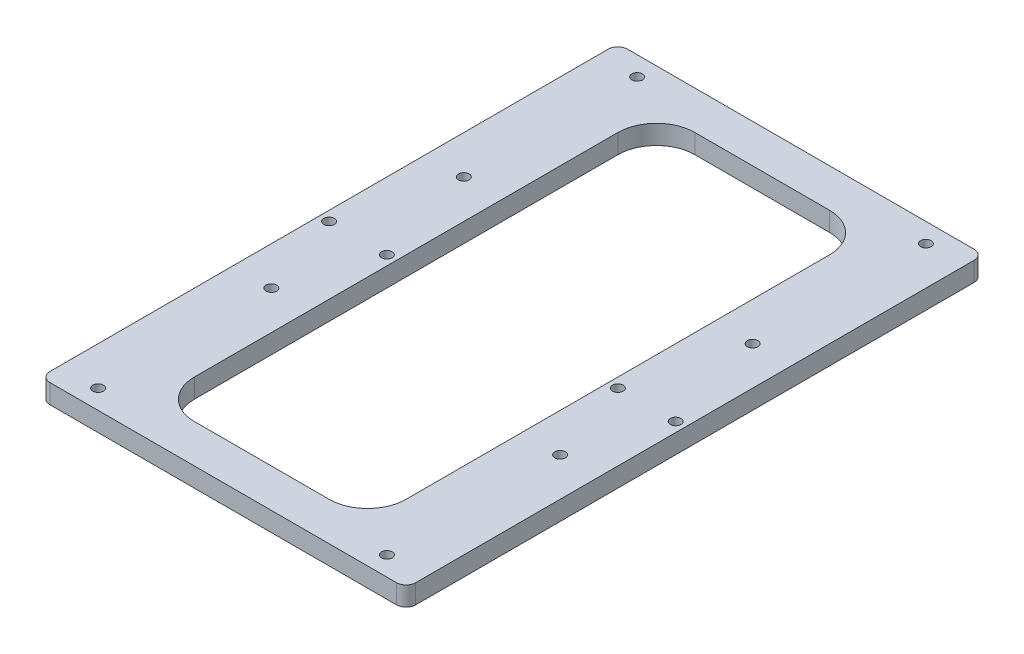
ISO-10303-21;
HEADER;
FILE_DESCRIPTION(('STEP AP214'),'2;1');
FILE_NAME('part.step','',(''),(''),'','','');
FILE_SCHEMA(('AUTOMOTIVE_DESIGN { 1 0 10303 214 1 1 1 1 }'));
ENDSEC;
DATA;
#1=APPLICATION_CONTEXT('core data for automotive mechanical design processes');
#2=APPLICATION_PROTOCOL_DEFINITION('international standard','automotive_design',2000,#1);
#3=PRODUCT_CONTEXT('',#1,'mechanical');
#4=PRODUCT('Part','Part','',(#3));
#5=PRODUCT_RELATED_PRODUCT_CATEGORY('part','',(#4));
#6=PRODUCT_DEFINITION_FORMATION('','',#4);
#7=PRODUCT_DEFINITION_CONTEXT('part definition',#1,'design');
#8=PRODUCT_DEFINITION('design','',#6,#7);
#9=PRODUCT_DEFINITION_SHAPE('','',#8);
#10=(LENGTH_UNIT() NAMED_UNIT(*) SI_UNIT(.MILLI.,.METRE.));
#11=(NAMED_UNIT(*) PLANE_ANGLE_UNIT() SI_UNIT($,.RADIAN.));
#12=(NAMED_UNIT(*) SI_UNIT($,.STERADIAN.) SOLID_ANGLE_UNIT());
#13=UNCERTAINTY_MEASURE_WITH_UNIT(LENGTH_MEASURE(1.E-05),#10,'distance_accuracy_value','');
#14=(GEOMETRIC_REPRESENTATION_CONTEXT(3) GLOBAL_UNCERTAINTY_ASSIGNED_CONTEXT((#13)) GLOBAL_UNIT_ASSIGNED_CONTEXT((#10,
#11,#12)) REPRESENTATION_CONTEXT('',''));
#15=CARTESIAN_POINT('',(0.,0.,0.));
#16=DIRECTION('',(0.,0.,1.));
#17=DIRECTION('',(1.,0.,0.));
#18=AXIS2_PLACEMENT_3D('',#15,#16,#17);
#19=CARTESIAN_POINT('',(-20.,10.,-150.));
#20=DIRECTION('',(1.,0.,0.));
#21=DIRECTION('',(0.,0.,-1.));
#22=AXIS2_PLACEMENT_3D('',#19,#20,#21);
#23=PLANE('',#22);
#24=DIRECTION('',(0.,0.,1.));
#25=VECTOR('',#24,1.);
#26=CARTESIAN_POINT('',(-20.,10.,-150.));
#27=LINE('',#26,#25);
#28=CARTESIAN_POINT('',(-20.,10.,-110.));
#29=VERTEX_POINT('',#28);
#30=CARTESIAN_POINT('',(-20.,10.,110.));
#31=VERTEX_POINT('',#30);
#32=EDGE_CURVE('E270',#29,#31,#27,.T.);
#33=ORIENTED_EDGE('',*,*,#32,.F.);
#34=DIRECTION('',(0.,1.,0.));
#35=VECTOR('',#34,1.);
#36=CARTESIAN_POINT('',(-20.,0.,-110.));
#37=LINE('',#36,#35);
#38=CARTESIAN_POINT('',(-20.,0.,-110.));
#39=VERTEX_POINT('',#38);
#40=EDGE_CURVE('E299',#29,#39,#37,.F.);
#41=ORIENTED_EDGE('',*,*,#40,.T.);
#42=DIRECTION('',(0.,0.,1.));
#43=VECTOR('',#42,1.);
#44=CARTESIAN_POINT('',(-20.,0.,-150.));
#45=LINE('',#44,#43);
#46=CARTESIAN_POINT('',(-20.,0.,110.));
#47=VERTEX_POINT('',#46);
#48=EDGE_CURVE('E282',#39,#47,#45,.T.);
#49=ORIENTED_EDGE('',*,*,#48,.T.);
#50=DIRECTION('',(0.,1.,0.));
#51=VECTOR('',#50,1.);
#52=CARTESIAN_POINT('',(-20.,10.,110.));
#53=LINE('',#52,#51);
#54=EDGE_CURVE('E296',#47,#31,#53,.T.);
#55=ORIENTED_EDGE('',*,*,#54,.T.);
#56=EDGE_LOOP('',(#33,#41,#49,#55));
#57=FACE_BOUND('',#56,.T.);
#58=ADVANCED_FACE('F16',(#57),#23,.F.);
#59=CARTESIAN_POINT('',(-130.,10.,-150.));
#60=DIRECTION('',(-1.,0.,0.));
#61=DIRECTION('',(0.,0.,1.));
#62=AXIS2_PLACEMENT_3D('',#59,#60,#61);
#63=PLANE('',#62);
#64=DIRECTION('',(0.,0.,-1.));
#65=VECTOR('',#64,1.);
#66=CARTESIAN_POINT('',(-130.,0.,-150.));
#67=LINE('',#66,#65);
#68=CARTESIAN_POINT('',(-130.,0.,110.));
#69=VERTEX_POINT('',#68);
#70=CARTESIAN_POINT('',(-130.,0.,-110.));
#71=VERTEX_POINT('',#70);
#72=EDGE_CURVE('E199',#69,#71,#67,.T.);
#73=ORIENTED_EDGE('',*,*,#72,.T.);
#74=DIRECTION('',(0.,1.,0.));
#75=VECTOR('',#74,1.);
#76=CARTESIAN_POINT('',(-130.,10.,-110.));
#77=LINE('',#76,#75);
#78=CARTESIAN_POINT('',(-130.,10.,-110.));
#79=VERTEX_POINT('',#78);
#80=EDGE_CURVE('E288',#71,#79,#77,.T.);
#81=ORIENTED_EDGE('',*,*,#80,.T.);
#82=DIRECTION('',(0.,0.,-1.));
#83=VECTOR('',#82,1.);
#84=CARTESIAN_POINT('',(-130.,10.,-150.));
#85=LINE('',#84,#83);
#86=CARTESIAN_POINT('',(-130.,10.,110.));
#87=VERTEX_POINT('',#86);
#88=EDGE_CURVE('E200',#87,#79,#85,.T.);
#89=ORIENTED_EDGE('',*,*,#88,.F.);
#90=DIRECTION('',(0.,1.,0.));
#91=VECTOR('',#90,1.);
#92=CARTESIAN_POINT('',(-130.,10.,110.));
#93=LINE('',#92,#91);
#94=EDGE_CURVE('E276',#87,#69,#93,.F.);
#95=ORIENTED_EDGE('',*,*,#94,.T.);
#96=EDGE_LOOP('',(#73,#81,#89,#95));
#97=FACE_BOUND('',#96,.T.);
#98=ADVANCED_FACE('F393',(#97),#63,.F.);
#99=CARTESIAN_POINT('',(0.,0.,0.));
#100=DIRECTION('',(0.,1.,0.));
#101=DIRECTION('',(0.,0.,1.));
#102=AXIS2_PLACEMENT_3D('',#99,#100,#101);
#103=PLANE('',#102);
#104=ORIENTED_EDGE('',*,*,#48,.F.);
#105=CARTESIAN_POINT('',(-40.,0.,-110.));
#106=DIRECTION('',(0.,1.,0.));
#107=DIRECTION('',(0.,0.,1.));
#108=AXIS2_PLACEMENT_3D('',#105,#106,#107);
#109=CIRCLE('',#108,20.);
#110=CARTESIAN_POINT('',(-40.,0.,-130.));
#111=VERTEX_POINT('',#110);
#112=EDGE_CURVE('E312',#39,#111,#109,.T.);
#113=ORIENTED_EDGE('',*,*,#112,.T.);
#114=DIRECTION('',(1.,0.,0.));
#115=VECTOR('',#114,1.);
#116=CARTESIAN_POINT('',(-20.,0.,-130.));
#117=LINE('',#116,#115);
#118=CARTESIAN_POINT('',(-110.,0.,-130.));
#119=VERTEX_POINT('',#118);
#120=EDGE_CURVE('E157',#119,#111,#117,.T.);
#121=ORIENTED_EDGE('',*,*,#120,.F.);
#122=CARTESIAN_POINT('',(-110.,0.,-110.));
#123=DIRECTION('',(0.,1.,0.));
#124=DIRECTION('',(0.,0.,1.));
#125=AXIS2_PLACEMENT_3D('',#122,#123,#124);
#126=CIRCLE('',#125,20.);
#127=EDGE_CURVE('E308',#119,#71,#126,.T.);
#128=ORIENTED_EDGE('',*,*,#127,.T.);
#129=ORIENTED_EDGE('',*,*,#72,.F.);
#130=CARTESIAN_POINT('',(-110.,0.,110.));
#131=DIRECTION('',(0.,1.,0.));
#132=DIRECTION('',(0.,0.,1.));
#133=AXIS2_PLACEMENT_3D('',#130,#131,#132);
#134=CIRCLE('',#133,20.);
#135=CARTESIAN_POINT('',(-110.,0.,130.));
#136=VERTEX_POINT('',#135);
#137=EDGE_CURVE('E320',#69,#136,#134,.T.);
#138=ORIENTED_EDGE('',*,*,#137,.T.);
#139=DIRECTION('',(1.,0.,0.));
#140=VECTOR('',#139,1.);
#141=CARTESIAN_POINT('',(-20.,0.,130.));
#142=LINE('',#141,#140);
#143=CARTESIAN_POINT('',(-40.,0.,130.));
#144=VERTEX_POINT('',#143);
#145=EDGE_CURVE('E212',#136,#144,#142,.T.);
#146=ORIENTED_EDGE('',*,*,#145,.T.);
#147=CARTESIAN_POINT('',(-40.,0.,110.));
#148=DIRECTION('',(0.,1.,0.));
#149=DIRECTION('',(0.,0.,1.));
#150=AXIS2_PLACEMENT_3D('',#147,#148,#149);
#151=CIRCLE('',#150,20.);
#152=EDGE_CURVE('E316',#144,#47,#151,.T.);
#153=ORIENTED_EDGE('',*,*,#152,.T.);
#154=EDGE_LOOP('',(#104,#113,#121,#128,#129,#138,#146,#153));
#155=FACE_BOUND('',#154,.T.);
#156=CARTESIAN_POINT('',(-150.,0.,-50.));
#157=DIRECTION('',(0.,1.,0.));
#158=DIRECTION('',(0.,0.,1.));
#159=AXIS2_PLACEMENT_3D('',#156,#157,#158);
#160=CIRCLE('',#159,2.75);
#161=CARTESIAN_POINT('',(-150.,0.,-47.25));
#162=VERTEX_POINT('',#161);
#163=EDGE_CURVE('E166',#162,#162,#160,.T.);
#164=ORIENTED_EDGE('',*,*,#163,.T.);
#165=EDGE_LOOP('',(#164));
#166=FACE_BOUND('',#165,.T.);
#167=CARTESIAN_POINT('',(-150.,0.,50.));
#168=DIRECTION('',(0.,1.,0.));
#169=DIRECTION('',(0.,0.,1.));
#170=AXIS2_PLACEMENT_3D('',#167,#168,#169);
#171=CIRCLE('',#170,2.75);
#172=CARTESIAN_POINT('',(-150.,0.,52.75));
#173=VERTEX_POINT('',#172);
#174=EDGE_CURVE('E172',#173,#173,#171,.T.);
#175=ORIENTED_EDGE('',*,*,#174,.T.);
#176=EDGE_LOOP('',(#175));
#177=FACE_BOUND('',#176,.T.);
#178=CARTESIAN_POINT('',(-150.,0.,140.));
#179=DIRECTION('',(0.,1.,0.));
#180=DIRECTION('',(0.,0.,1.));
#181=AXIS2_PLACEMENT_3D('',#178,#179,#180);
#182=CIRCLE('',#181,2.75);
#183=CARTESIAN_POINT('',(-150.,0.,142.75));
#184=VERTEX_POINT('',#183);
#185=EDGE_CURVE('E178',#184,#184,#182,.T.);
#186=ORIENTED_EDGE('',*,*,#185,.T.);
#187=EDGE_LOOP('',(#186));
#188=FACE_BOUND('',#187,.T.);
#189=CARTESIAN_POINT('',(-150.,0.,-140.));
#190=DIRECTION('',(0.,1.,0.));
#191=DIRECTION('',(0.,0.,1.));
#192=AXIS2_PLACEMENT_3D('',#189,#190,#191);
#193=CIRCLE('',#192,2.75);
#194=CARTESIAN_POINT('',(-150.,0.,-137.25));
#195=VERTEX_POINT('',#194);
#196=EDGE_CURVE('E184',#195,#195,#193,.T.);
#197=ORIENTED_EDGE('',*,*,#196,.T.);
#198=EDGE_LOOP('',(#197));
#199=FACE_BOUND('',#198,.T.);
#200=CARTESIAN_POINT('',(-135.,0.,5.));
#201=DIRECTION('',(0.,1.,0.));
#202=DIRECTION('',(0.,0.,1.));
#203=AXIS2_PLACEMENT_3D('',#200,#201,#202);
#204=CIRCLE('',#203,2.75);
#205=CARTESIAN_POINT('',(-135.,0.,7.75));
#206=VERTEX_POINT('',#205);
#207=EDGE_CURVE('E187',#206,#206,#204,.T.);
#208=ORIENTED_EDGE('',*,*,#207,.T.);
#209=EDGE_LOOP('',(#208));
#210=FACE_BOUND('',#209,.T.);
#211=CARTESIAN_POINT('',(-165.,0.,5.));
#212=DIRECTION('',(0.,1.,0.));
#213=DIRECTION('',(0.,0.,1.));
#214=AXIS2_PLACEMENT_3D('',#211,#212,#213);
#215=CIRCLE('',#214,2.75);
#216=CARTESIAN_POINT('',(-165.,0.,7.75));
#217=VERTEX_POINT('',#216);
#218=EDGE_CURVE('E193',#217,#217,#215,.T.);
#219=ORIENTED_EDGE('',*,*,#218,.T.);
#220=EDGE_LOOP('',(#219));
#221=FACE_BOUND('',#220,.T.);
#222=CARTESIAN_POINT('',(17.,0.,-1.5));
#223=DIRECTION('',(0.,-1.,0.));
#224=DIRECTION('',(0.,0.,-1.));
#225=AXIS2_PLACEMENT_3D('',#222,#223,#224);
#226=CIRCLE('',#225,1.49999999999999);
#227=CARTESIAN_POINT('',(17.,0.,-2.99999999999999));
#228=VERTEX_POINT('',#227);
#229=EDGE_CURVE('E215',#228,#228,#226,.T.);
#230=ORIENTED_EDGE('',*,*,#229,.F.);
#231=EDGE_LOOP('',(#230));
#232=FACE_BOUND('',#231,.T.);
#233=CARTESIAN_POINT('',(-17.,0.,-1.5));
#234=DIRECTION('',(0.,-1.,0.));
#235=DIRECTION('',(0.,0.,-1.));
#236=AXIS2_PLACEMENT_3D('',#233,#234,#235);
#237=CIRCLE('',#236,1.5);
#238=CARTESIAN_POINT('',(-17.,0.,-3.));
#239=VERTEX_POINT('',#238);
#240=EDGE_CURVE('E221',#239,#239,#237,.T.);
#241=ORIENTED_EDGE('',*,*,#240,.F.);
#242=EDGE_LOOP('',(#241));
#243=FACE_BOUND('',#242,.T.);
#244=CARTESIAN_POINT('',(0.,0.,-50.));
#245=DIRECTION('',(0.,1.,0.));
#246=DIRECTION('',(0.,0.,1.));
#247=AXIS2_PLACEMENT_3D('',#244,#245,#246);
#248=CIRCLE('',#247,2.75);
#249=CARTESIAN_POINT('',(0.,0.,-47.25));
#250=VERTEX_POINT('',#249);
#251=EDGE_CURVE('E230',#250,#250,#248,.T.);
#252=ORIENTED_EDGE('',*,*,#251,.T.);
#253=EDGE_LOOP('',(#252));
#254=FACE_BOUND('',#253,.T.);
#255=CARTESIAN_POINT('',(0.,0.,50.));
#256=DIRECTION('',(0.,1.,0.));
#257=DIRECTION('',(0.,0.,1.));
#258=AXIS2_PLACEMENT_3D('',#255,#256,#257);
#259=CIRCLE('',#258,2.75);
#260=CARTESIAN_POINT('',(0.,0.,52.75));
#261=VERTEX_POINT('',#260);
#262=EDGE_CURVE('E236',#261,#261,#259,.T.);
#263=ORIENTED_EDGE('',*,*,#262,.T.);
#264=EDGE_LOOP('',(#263));
#265=FACE_BOUND('',#264,.T.);
#266=CARTESIAN_POINT('',(0.,0.,140.));
#267=DIRECTION('',(0.,1.,0.));
#268=DIRECTION('',(0.,0.,1.));
#269=AXIS2_PLACEMENT_3D('',#266,#267,#268);
#270=CIRCLE('',#269,2.75);
#271=CARTESIAN_POINT('',(0.,0.,142.75));
#272=VERTEX_POINT('',#271);
#273=EDGE_CURVE('E242',#272,#272,#270,.T.);
#274=ORIENTED_EDGE('',*,*,#273,.T.);
#275=EDGE_LOOP('',(#274));
#276=FACE_BOUND('',#275,.T.);
#277=CARTESIAN_POINT('',(0.,0.,-140.));
#278=DIRECTION('',(0.,1.,0.));
#279=DIRECTION('',(0.,0.,1.));
#280=AXIS2_PLACEMENT_3D('',#277,#278,#279);
#281=CIRCLE('',#280,2.75);
#282=CARTESIAN_POINT('',(0.,0.,-137.25));
#283=VERTEX_POINT('',#282);
#284=EDGE_CURVE('E248',#283,#283,#281,.T.);
#285=ORIENTED_EDGE('',*,*,#284,.T.);
#286=EDGE_LOOP('',(#285));
#287=FACE_BOUND('',#286,.T.);
#288=CARTESIAN_POINT('',(-15.,0.,5.));
#289=DIRECTION('',(0.,1.,0.));
#290=DIRECTION('',(0.,0.,1.));
#291=AXIS2_PLACEMENT_3D('',#288,#289,#290);
#292=CIRCLE('',#291,2.75);
#293=CARTESIAN_POINT('',(-15.,0.,7.75));
#294=VERTEX_POINT('',#293);
#295=EDGE_CURVE('E254',#294,#294,#292,.T.);
#296=ORIENTED_EDGE('',*,*,#295,.T.);
#297=EDGE_LOOP('',(#296));
#298=FACE_BOUND('',#297,.T.);
#299=CARTESIAN_POINT('',(15.,0.,5.));
#300=DIRECTION('',(0.,1.,0.));
#301=DIRECTION('',(0.,0.,1.));
#302=AXIS2_PLACEMENT_3D('',#299,#300,#301);
#303=CIRCLE('',#302,2.75);
#304=CARTESIAN_POINT('',(15.,0.,7.75));
#305=VERTEX_POINT('',#304);
#306=EDGE_CURVE('E260',#305,#305,#303,.T.);
#307=ORIENTED_EDGE('',*,*,#306,.T.);
#308=EDGE_LOOP('',(#307));
#309=FACE_BOUND('',#308,.T.);
#310=DIRECTION('',(0.,0.,-1.));
#311=VECTOR('',#310,1.);
#312=CARTESIAN_POINT('',(20.,0.,-150.));
#313=LINE('',#312,#311);
#314=CARTESIAN_POINT('',(20.,0.,145.));
#315=VERTEX_POINT('',#314);
#316=CARTESIAN_POINT('',(20.,0.,-145.));
#317=VERTEX_POINT('',#316);
#318=EDGE_CURVE('E263',#315,#317,#313,.T.);
#319=ORIENTED_EDGE('',*,*,#318,.F.);
#320=CARTESIAN_POINT('',(15.,0.,145.));
#321=DIRECTION('',(0.,1.,0.));
#322=DIRECTION('',(0.,0.,1.));
#323=AXIS2_PLACEMENT_3D('',#320,#321,#322);
#324=CIRCLE('',#323,5.);
#325=CARTESIAN_POINT('',(15.,0.,150.));
#326=VERTEX_POINT('',#325);
#327=EDGE_CURVE('E333',#315,#326,#324,.F.);
#328=ORIENTED_EDGE('',*,*,#327,.T.);
#329=DIRECTION('',(1.,0.,0.));
#330=VECTOR('',#329,1.);
#331=CARTESIAN_POINT('',(-20.,0.,150.));
#332=LINE('',#331,#330);
#333=CARTESIAN_POINT('',(-165.,0.,150.));
#334=VERTEX_POINT('',#333);
#335=EDGE_CURVE('E268',#334,#326,#332,.T.);
#336=ORIENTED_EDGE('',*,*,#335,.F.);
#337=CARTESIAN_POINT('',(-165.,0.,145.));
#338=DIRECTION('',(0.,1.,0.));
#339=DIRECTION('',(0.,0.,1.));
#340=AXIS2_PLACEMENT_3D('',#337,#338,#339);
#341=CIRCLE('',#340,5.);
#342=CARTESIAN_POINT('',(-170.,0.,145.));
#343=VERTEX_POINT('',#342);
#344=EDGE_CURVE('E331',#334,#343,#341,.F.);
#345=ORIENTED_EDGE('',*,*,#344,.T.);
#346=DIRECTION('',(0.,0.,1.));
#347=VECTOR('',#346,1.);
#348=CARTESIAN_POINT('',(-170.,0.,-150.));
#349=LINE('',#348,#347);
#350=CARTESIAN_POINT('',(-170.,0.,-145.));
#351=VERTEX_POINT('',#350);
#352=EDGE_CURVE('E204',#351,#343,#349,.T.);
#353=ORIENTED_EDGE('',*,*,#352,.F.);
#354=CARTESIAN_POINT('',(-165.,0.,-145.));
#355=DIRECTION('',(0.,1.,0.));
#356=DIRECTION('',(0.,0.,1.));
#357=AXIS2_PLACEMENT_3D('',#354,#355,#356);
#358=CIRCLE('',#357,5.);
#359=CARTESIAN_POINT('',(-165.,0.,-150.));
#360=VERTEX_POINT('',#359);
#361=EDGE_CURVE('E329',#351,#360,#358,.F.);
#362=ORIENTED_EDGE('',*,*,#361,.T.);
#363=DIRECTION('',(-1.,0.,0.));
#364=VECTOR('',#363,1.);
#365=CARTESIAN_POINT('',(-20.,0.,-150.));
#366=LINE('',#365,#364);
#367=CARTESIAN_POINT('',(15.,0.,-150.));
#368=VERTEX_POINT('',#367);
#369=EDGE_CURVE('E279',#368,#360,#366,.T.);
#370=ORIENTED_EDGE('',*,*,#369,.F.);
#371=CARTESIAN_POINT('',(15.,0.,-145.));
#372=DIRECTION('',(0.,1.,0.));
#373=DIRECTION('',(0.,0.,1.));
#374=AXIS2_PLACEMENT_3D('',#371,#372,#373);
#375=CIRCLE('',#374,5.);
#376=EDGE_CURVE('E327',#368,#317,#375,.F.);
#377=ORIENTED_EDGE('',*,*,#376,.T.);
#378=EDGE_LOOP('',(#319,#328,#336,#345,#353,#362,#370,#377));
#379=FACE_BOUND('',#378,.T.);
#380=CARTESIAN_POINT('',(-167.,0.,-1.5));
#381=DIRECTION('',(0.,-1.,0.));
#382=DIRECTION('',(0.,0.,-1.));
#383=AXIS2_PLACEMENT_3D('',#380,#381,#382);
#384=CIRCLE('',#383,1.5);
#385=CARTESIAN_POINT('',(-167.,0.,-3.));
#386=VERTEX_POINT('',#385);
#387=EDGE_CURVE('E150',#386,#386,#384,.T.);
#388=ORIENTED_EDGE('',*,*,#387,.F.);
#389=EDGE_LOOP('',(#388));
#390=FACE_BOUND('',#389,.T.);
#391=CARTESIAN_POINT('',(-133.,0.,-1.5));
#392=DIRECTION('',(0.,-1.,0.));
#393=DIRECTION('',(0.,0.,-1.));
#394=AXIS2_PLACEMENT_3D('',#391,#392,#393);
#395=CIRCLE('',#394,1.5);
#396=CARTESIAN_POINT('',(-133.,0.,-3.));
#397=VERTEX_POINT('',#396);
#398=EDGE_CURVE('E151',#397,#397,#395,.T.);
#399=ORIENTED_EDGE('',*,*,#398,.F.);
#400=EDGE_LOOP('',(#399));
#401=FACE_BOUND('',#400,.T.);
#402=ADVANCED_FACE('F361',(#155,#166,#177,#188,#199,#210,#221,#232,#243,#254,#265,#276,#287,
#298,#309,#379,#390,#401),#103,.F.);
#403=CARTESIAN_POINT('',(20.,10.,-150.));
#404=DIRECTION('',(-1.,0.,0.));
#405=DIRECTION('',(0.,0.,1.));
#406=AXIS2_PLACEMENT_3D('',#403,#404,#405);
#407=PLANE('',#406);
#408=DIRECTION('',(0.,0.,-1.));
#409=VECTOR('',#408,1.);
#410=CARTESIAN_POINT('',(20.,10.,-150.));
#411=LINE('',#410,#409);
#412=CARTESIAN_POINT('',(20.,10.,145.));
#413=VERTEX_POINT('',#412);
#414=CARTESIAN_POINT('',(20.,10.,-145.));
#415=VERTEX_POINT('',#414);
#416=EDGE_CURVE('E264',#413,#415,#411,.T.);
#417=ORIENTED_EDGE('',*,*,#416,.F.);
#418=DIRECTION('',(0.,-1.,0.));
#419=VECTOR('',#418,1.);
#420=CARTESIAN_POINT('',(20.,10.,145.));
#421=LINE('',#420,#419);
#422=EDGE_CURVE('E324',#413,#315,#421,.T.);
#423=ORIENTED_EDGE('',*,*,#422,.T.);
#424=ORIENTED_EDGE('',*,*,#318,.T.);
#425=DIRECTION('',(0.,-1.,0.));
#426=VECTOR('',#425,1.);
#427=CARTESIAN_POINT('',(20.,10.,-145.));
#428=LINE('',#427,#426);
#429=EDGE_CURVE('E322',#317,#415,#428,.F.);
#430=ORIENTED_EDGE('',*,*,#429,.T.);
#431=EDGE_LOOP('',(#417,#423,#424,#430));
#432=FACE_BOUND('',#431,.T.);
#433=ADVANCED_FACE('F384',(#432),#407,.F.);
#434=CARTESIAN_POINT('',(-20.,10.,-150.));
#435=DIRECTION('',(0.,0.,1.));
#436=DIRECTION('',(1.,0.,0.));
#437=AXIS2_PLACEMENT_3D('',#434,#435,#436);
#438=PLANE('',#437);
#439=ORIENTED_EDGE('',*,*,#369,.T.);
#440=DIRECTION('',(0.,-1.,0.));
#441=VECTOR('',#440,1.);
#442=CARTESIAN_POINT('',(-165.,10.,-150.));
#443=LINE('',#442,#441);
#444=CARTESIAN_POINT('',(-165.,10.,-150.));
#445=VERTEX_POINT('',#444);
#446=EDGE_CURVE('E11',#360,#445,#443,.F.);
#447=ORIENTED_EDGE('',*,*,#446,.T.);
#448=DIRECTION('',(-1.,0.,0.));
#449=VECTOR('',#448,1.);
#450=CARTESIAN_POINT('',(-20.,10.,-150.));
#451=LINE('',#450,#449);
#452=CARTESIAN_POINT('',(15.,10.,-150.));
#453=VERTEX_POINT('',#452);
#454=EDGE_CURVE('E267',#453,#445,#451,.T.);
#455=ORIENTED_EDGE('',*,*,#454,.F.);
#456=DIRECTION('',(0.,-1.,0.));
#457=VECTOR('',#456,1.);
#458=CARTESIAN_POINT('',(15.,10.,-150.));
#459=LINE('',#458,#457);
#460=EDGE_CURVE('E24',#453,#368,#459,.T.);
#461=ORIENTED_EDGE('',*,*,#460,.T.);
#462=EDGE_LOOP('',(#439,#447,#455,#461));
#463=FACE_BOUND('',#462,.T.);
#464=ADVANCED_FACE('F355',(#463),#438,.F.);
#465=CARTESIAN_POINT('',(-20.,10.,150.));
#466=DIRECTION('',(0.,0.,-1.));
#467=DIRECTION('',(-1.,0.,0.));
#468=AXIS2_PLACEMENT_3D('',#465,#466,#467);
#469=PLANE('',#468);
#470=ORIENTED_EDGE('',*,*,#335,.T.);
#471=DIRECTION('',(0.,-1.,0.));
#472=VECTOR('',#471,1.);
#473=CARTESIAN_POINT('',(15.,10.,150.));
#474=LINE('',#473,#472);
#475=CARTESIAN_POINT('',(15.,10.,150.));
#476=VERTEX_POINT('',#475);
#477=EDGE_CURVE('E338',#326,#476,#474,.F.);
#478=ORIENTED_EDGE('',*,*,#477,.T.);
#479=DIRECTION('',(1.,0.,0.));
#480=VECTOR('',#479,1.);
#481=CARTESIAN_POINT('',(-20.,10.,150.));
#482=LINE('',#481,#480);
#483=CARTESIAN_POINT('',(-165.,10.,150.));
#484=VERTEX_POINT('',#483);
#485=EDGE_CURVE('E273',#484,#476,#482,.T.);
#486=ORIENTED_EDGE('',*,*,#485,.F.);
#487=DIRECTION('',(0.,-1.,0.));
#488=VECTOR('',#487,1.);
#489=CARTESIAN_POINT('',(-165.,10.,150.));
#490=LINE('',#489,#488);
#491=EDGE_CURVE('E335',#484,#334,#490,.T.);
#492=ORIENTED_EDGE('',*,*,#491,.T.);
#493=EDGE_LOOP('',(#470,#478,#486,#492));
#494=FACE_BOUND('',#493,.T.);
#495=ADVANCED_FACE('F376',(#494),#469,.F.);
#496=CARTESIAN_POINT('',(0.,10.,0.));
#497=DIRECTION('',(0.,1.,0.));
#498=DIRECTION('',(0.,0.,1.));
#499=AXIS2_PLACEMENT_3D('',#496,#497,#498);
#500=PLANE('',#499);
#501=DIRECTION('',(-1.,0.,0.));
#502=VECTOR('',#501,1.);
#503=CARTESIAN_POINT('',(-20.,10.,-130.));
#504=LINE('',#503,#502);
#505=CARTESIAN_POINT('',(-40.,10.,-130.));
#506=VERTEX_POINT('',#505);
#507=CARTESIAN_POINT('',(-110.,10.,-130.));
#508=VERTEX_POINT('',#507);
#509=EDGE_CURVE('E798',#506,#508,#504,.T.);
#510=ORIENTED_EDGE('',*,*,#509,.F.);
#511=CARTESIAN_POINT('',(-40.,10.,-110.));
#512=DIRECTION('',(0.,1.,0.));
#513=DIRECTION('',(0.,0.,1.));
#514=AXIS2_PLACEMENT_3D('',#511,#512,#513);
#515=CIRCLE('',#514,20.);
#516=EDGE_CURVE('E310',#506,#29,#515,.F.);
#517=ORIENTED_EDGE('',*,*,#516,.T.);
#518=ORIENTED_EDGE('',*,*,#32,.T.);
#519=CARTESIAN_POINT('',(-40.,10.,110.));
#520=DIRECTION('',(0.,1.,0.));
#521=DIRECTION('',(0.,0.,1.));
#522=AXIS2_PLACEMENT_3D('',#519,#520,#521);
#523=CIRCLE('',#522,20.);
#524=CARTESIAN_POINT('',(-40.,10.,130.));
#525=VERTEX_POINT('',#524);
#526=EDGE_CURVE('E314',#31,#525,#523,.F.);
#527=ORIENTED_EDGE('',*,*,#526,.T.);
#528=DIRECTION('',(-1.,0.,0.));
#529=VECTOR('',#528,1.);
#530=CARTESIAN_POINT('',(-20.,10.,130.));
#531=LINE('',#530,#529);
#532=CARTESIAN_POINT('',(-110.,10.,130.));
#533=VERTEX_POINT('',#532);
#534=EDGE_CURVE('E206',#525,#533,#531,.T.);
#535=ORIENTED_EDGE('',*,*,#534,.T.);
#536=CARTESIAN_POINT('',(-110.,10.,110.));
#537=DIRECTION('',(0.,1.,0.));
#538=DIRECTION('',(0.,0.,1.));
#539=AXIS2_PLACEMENT_3D('',#536,#537,#538);
#540=CIRCLE('',#539,20.);
#541=EDGE_CURVE('E318',#533,#87,#540,.F.);
#542=ORIENTED_EDGE('',*,*,#541,.T.);
#543=ORIENTED_EDGE('',*,*,#88,.T.);
#544=CARTESIAN_POINT('',(-110.,10.,-110.));
#545=DIRECTION('',(0.,1.,0.));
#546=DIRECTION('',(0.,0.,1.));
#547=AXIS2_PLACEMENT_3D('',#544,#545,#546);
#548=CIRCLE('',#547,20.);
#549=EDGE_CURVE('E306',#79,#508,#548,.F.);
#550=ORIENTED_EDGE('',*,*,#549,.T.);
#551=EDGE_LOOP('',(#510,#517,#518,#527,#535,#542,#543,#550));
#552=FACE_BOUND('',#551,.T.);
#553=CARTESIAN_POINT('',(-150.,10.,-50.));
#554=DIRECTION('',(0.,1.,0.));
#555=DIRECTION('',(0.,0.,1.));
#556=AXIS2_PLACEMENT_3D('',#553,#554,#555);
#557=CIRCLE('',#556,2.75);
#558=CARTESIAN_POINT('',(-150.,10.,-47.25));
#559=VERTEX_POINT('',#558);
#560=EDGE_CURVE('E163',#559,#559,#557,.T.);
#561=ORIENTED_EDGE('',*,*,#560,.F.);
#562=EDGE_LOOP('',(#561));
#563=FACE_BOUND('',#562,.T.);
#564=CARTESIAN_POINT('',(-150.,10.,50.));
#565=DIRECTION('',(0.,1.,0.));
#566=DIRECTION('',(0.,0.,1.));
#567=AXIS2_PLACEMENT_3D('',#564,#565,#566);
#568=CIRCLE('',#567,2.75);
#569=CARTESIAN_POINT('',(-150.,10.,52.75));
#570=VERTEX_POINT('',#569);
#571=EDGE_CURVE('E169',#570,#570,#568,.T.);
#572=ORIENTED_EDGE('',*,*,#571,.F.);
#573=EDGE_LOOP('',(#572));
#574=FACE_BOUND('',#573,.T.);
#575=CARTESIAN_POINT('',(-150.,10.,140.));
#576=DIRECTION('',(0.,1.,0.));
#577=DIRECTION('',(0.,0.,1.));
#578=AXIS2_PLACEMENT_3D('',#575,#576,#577);
#579=CIRCLE('',#578,2.75);
#580=CARTESIAN_POINT('',(-150.,10.,142.75));
#581=VERTEX_POINT('',#580);
#582=EDGE_CURVE('E175',#581,#581,#579,.T.);
#583=ORIENTED_EDGE('',*,*,#582,.F.);
#584=EDGE_LOOP('',(#583));
#585=FACE_BOUND('',#584,.T.);
#586=CARTESIAN_POINT('',(-150.,10.,-140.));
#587=DIRECTION('',(0.,1.,0.));
#588=DIRECTION('',(0.,0.,1.));
#589=AXIS2_PLACEMENT_3D('',#586,#587,#588);
#590=CIRCLE('',#589,2.75);
#591=CARTESIAN_POINT('',(-150.,10.,-137.25));
#592=VERTEX_POINT('',#591);
#593=EDGE_CURVE('E181',#592,#592,#590,.T.);
#594=ORIENTED_EDGE('',*,*,#593,.F.);
#595=EDGE_LOOP('',(#594));
#596=FACE_BOUND('',#595,.T.);
#597=CARTESIAN_POINT('',(-135.,10.,5.));
#598=DIRECTION('',(0.,1.,0.));
#599=DIRECTION('',(0.,0.,1.));
#600=AXIS2_PLACEMENT_3D('',#597,#598,#599);
#601=CIRCLE('',#600,2.75);
#602=CARTESIAN_POINT('',(-135.,10.,7.75));
#603=VERTEX_POINT('',#602);
#604=EDGE_CURVE('E190',#603,#603,#601,.T.);
#605=ORIENTED_EDGE('',*,*,#604,.F.);
#606=EDGE_LOOP('',(#605));
#607=FACE_BOUND('',#606,.T.);
#608=CARTESIAN_POINT('',(-165.,10.,5.));
#609=DIRECTION('',(0.,1.,0.));
#610=DIRECTION('',(0.,0.,1.));
#611=AXIS2_PLACEMENT_3D('',#608,#609,#610);
#612=CIRCLE('',#611,2.75);
#613=CARTESIAN_POINT('',(-165.,10.,7.75));
#614=VERTEX_POINT('',#613);
#615=EDGE_CURVE('E196',#614,#614,#612,.T.);
#616=ORIENTED_EDGE('',*,*,#615,.F.);
#617=EDGE_LOOP('',(#616));
#618=FACE_BOUND('',#617,.T.);
#619=CARTESIAN_POINT('',(0.,10.,-50.));
#620=DIRECTION('',(0.,1.,0.));
#621=DIRECTION('',(0.,0.,1.));
#622=AXIS2_PLACEMENT_3D('',#619,#620,#621);
#623=CIRCLE('',#622,2.75);
#624=CARTESIAN_POINT('',(0.,10.,-47.25));
#625=VERTEX_POINT('',#624);
#626=EDGE_CURVE('E227',#625,#625,#623,.T.);
#627=ORIENTED_EDGE('',*,*,#626,.F.);
#628=EDGE_LOOP('',(#627));
#629=FACE_BOUND('',#628,.T.);
#630=CARTESIAN_POINT('',(0.,10.,50.));
#631=DIRECTION('',(0.,1.,0.));
#632=DIRECTION('',(0.,0.,1.));
#633=AXIS2_PLACEMENT_3D('',#630,#631,#632);
#634=CIRCLE('',#633,2.75);
#635=CARTESIAN_POINT('',(0.,10.,52.75));
#636=VERTEX_POINT('',#635);
#637=EDGE_CURVE('E233',#636,#636,#634,.T.);
#638=ORIENTED_EDGE('',*,*,#637,.F.);
#639=EDGE_LOOP('',(#638));
#640=FACE_BOUND('',#639,.T.);
#641=CARTESIAN_POINT('',(0.,10.,140.));
#642=DIRECTION('',(0.,1.,0.));
#643=DIRECTION('',(0.,0.,1.));
#644=AXIS2_PLACEMENT_3D('',#641,#642,#643);
#645=CIRCLE('',#644,2.75);
#646=CARTESIAN_POINT('',(0.,10.,142.75));
#647=VERTEX_POINT('',#646);
#648=EDGE_CURVE('E239',#647,#647,#645,.T.);
#649=ORIENTED_EDGE('',*,*,#648,.F.);
#650=EDGE_LOOP('',(#649));
#651=FACE_BOUND('',#650,.T.);
#652=CARTESIAN_POINT('',(0.,10.,-140.));
#653=DIRECTION('',(0.,1.,0.));
#654=DIRECTION('',(0.,0.,1.));
#655=AXIS2_PLACEMENT_3D('',#652,#653,#654);
#656=CIRCLE('',#655,2.75);
#657=CARTESIAN_POINT('',(0.,10.,-137.25));
#658=VERTEX_POINT('',#657);
#659=EDGE_CURVE('E245',#658,#658,#656,.T.);
#660=ORIENTED_EDGE('',*,*,#659,.F.);
#661=EDGE_LOOP('',(#660));
#662=FACE_BOUND('',#661,.T.);
#663=CARTESIAN_POINT('',(-15.,10.,5.));
#664=DIRECTION('',(0.,1.,0.));
#665=DIRECTION('',(0.,0.,1.));
#666=AXIS2_PLACEMENT_3D('',#663,#664,#665);
#667=CIRCLE('',#666,2.75);
#668=CARTESIAN_POINT('',(-15.,10.,7.75));
#669=VERTEX_POINT('',#668);
#670=EDGE_CURVE('E251',#669,#669,#667,.T.);
#671=ORIENTED_EDGE('',*,*,#670,.F.);
#672=EDGE_LOOP('',(#671));
#673=FACE_BOUND('',#672,.T.);
#674=CARTESIAN_POINT('',(15.,10.,5.));
#675=DIRECTION('',(0.,1.,0.));
#676=DIRECTION('',(0.,0.,1.));
#677=AXIS2_PLACEMENT_3D('',#674,#675,#676);
#678=CIRCLE('',#677,2.75);
#679=CARTESIAN_POINT('',(15.,10.,7.75));
#680=VERTEX_POINT('',#679);
#681=EDGE_CURVE('E257',#680,#680,#678,.T.);
#682=ORIENTED_EDGE('',*,*,#681,.F.);
#683=EDGE_LOOP('',(#682));
#684=FACE_BOUND('',#683,.T.);
#685=ORIENTED_EDGE('',*,*,#485,.T.);
#686=CARTESIAN_POINT('',(15.,10.,145.));
#687=DIRECTION('',(0.,1.,0.));
#688=DIRECTION('',(0.,0.,1.));
#689=AXIS2_PLACEMENT_3D('',#686,#687,#688);
#690=CIRCLE('',#689,5.);
#691=EDGE_CURVE('E345',#476,#413,#690,.T.);
#692=ORIENTED_EDGE('',*,*,#691,.T.);
#693=ORIENTED_EDGE('',*,*,#416,.T.);
#694=CARTESIAN_POINT('',(15.,10.,-145.));
#695=DIRECTION('',(0.,1.,0.));
#696=DIRECTION('',(0.,0.,1.));
#697=AXIS2_PLACEMENT_3D('',#694,#695,#696);
#698=CIRCLE('',#697,5.);
#699=EDGE_CURVE('E340',#415,#453,#698,.T.);
#700=ORIENTED_EDGE('',*,*,#699,.T.);
#701=ORIENTED_EDGE('',*,*,#454,.T.);
#702=CARTESIAN_POINT('',(-165.,10.,-145.));
#703=DIRECTION('',(0.,1.,0.));
#704=DIRECTION('',(0.,0.,1.));
#705=AXIS2_PLACEMENT_3D('',#702,#703,#704);
#706=CIRCLE('',#705,5.);
#707=CARTESIAN_POINT('',(-170.,10.,-145.));
#708=VERTEX_POINT('',#707);
#709=EDGE_CURVE('E38',#445,#708,#706,.T.);
#710=ORIENTED_EDGE('',*,*,#709,.T.);
#711=DIRECTION('',(0.,0.,1.));
#712=VECTOR('',#711,1.);
#713=CARTESIAN_POINT('',(-170.,10.,-150.));
#714=LINE('',#713,#712);
#715=CARTESIAN_POINT('',(-170.,10.,145.));
#716=VERTEX_POINT('',#715);
#717=EDGE_CURVE('E203',#708,#716,#714,.T.);
#718=ORIENTED_EDGE('',*,*,#717,.T.);
#719=CARTESIAN_POINT('',(-165.,10.,145.));
#720=DIRECTION('',(0.,1.,0.));
#721=DIRECTION('',(0.,0.,1.));
#722=AXIS2_PLACEMENT_3D('',#719,#720,#721);
#723=CIRCLE('',#722,5.);
#724=EDGE_CURVE('E343',#716,#484,#723,.T.);
#725=ORIENTED_EDGE('',*,*,#724,.T.);
#726=EDGE_LOOP('',(#685,#692,#693,#700,#701,#710,#718,#725));
#727=FACE_BOUND('',#726,.T.);
#728=ADVANCED_FACE('F369',(#552,#563,#574,#585,#596,#607,#618,#629,#640,#651,#662,#673,#684,
#727),#500,.T.);
#729=CARTESIAN_POINT('',(15.,10.,5.));
#730=DIRECTION('',(0.,1.,0.));
#731=DIRECTION('',(0.,0.,1.));
#732=AXIS2_PLACEMENT_3D('',#729,#730,#731);
#733=CYLINDRICAL_SURFACE('',#732,2.75);
#734=ORIENTED_EDGE('',*,*,#306,.F.);
#735=EDGE_LOOP('',(#734));
#736=FACE_BOUND('',#735,.T.);
#737=ORIENTED_EDGE('',*,*,#681,.T.);
#738=EDGE_LOOP('',(#737));
#739=FACE_BOUND('',#738,.T.);
#740=ADVANCED_FACE('F692',(#736,#739),#733,.F.);
#741=CARTESIAN_POINT('',(-15.,10.,5.));
#742=DIRECTION('',(0.,1.,0.));
#743=DIRECTION('',(0.,0.,1.));
#744=AXIS2_PLACEMENT_3D('',#741,#742,#743);
#745=CYLINDRICAL_SURFACE('',#744,2.75);
#746=ORIENTED_EDGE('',*,*,#295,.F.);
#747=EDGE_LOOP('',(#746));
#748=FACE_BOUND('',#747,.T.);
#749=ORIENTED_EDGE('',*,*,#670,.T.);
#750=EDGE_LOOP('',(#749));
#751=FACE_BOUND('',#750,.T.);
#752=ADVANCED_FACE('F683',(#748,#751),#745,.F.);
#753=CARTESIAN_POINT('',(0.,10.,-140.));
#754=DIRECTION('',(0.,1.,0.));
#755=DIRECTION('',(0.,0.,1.));
#756=AXIS2_PLACEMENT_3D('',#753,#754,#755);
#757=CYLINDRICAL_SURFACE('',#756,2.75);
#758=ORIENTED_EDGE('',*,*,#284,.F.);
#759=EDGE_LOOP('',(#758));
#760=FACE_BOUND('',#759,.T.);
#761=ORIENTED_EDGE('',*,*,#659,.T.);
#762=EDGE_LOOP('',(#761));
#763=FACE_BOUND('',#762,.T.);
#764=ADVANCED_FACE('F674',(#760,#763),#757,.F.);
#765=CARTESIAN_POINT('',(0.,10.,140.));
#766=DIRECTION('',(0.,1.,0.));
#767=DIRECTION('',(0.,0.,1.));
#768=AXIS2_PLACEMENT_3D('',#765,#766,#767);
#769=CYLINDRICAL_SURFACE('',#768,2.75);
#770=ORIENTED_EDGE('',*,*,#273,.F.);
#771=EDGE_LOOP('',(#770));
#772=FACE_BOUND('',#771,.T.);
#773=ORIENTED_EDGE('',*,*,#648,.T.);
#774=EDGE_LOOP('',(#773));
#775=FACE_BOUND('',#774,.T.);
#776=ADVANCED_FACE('F665',(#772,#775),#769,.F.);
#777=CARTESIAN_POINT('',(0.,10.,50.));
#778=DIRECTION('',(0.,1.,0.));
#779=DIRECTION('',(0.,0.,1.));
#780=AXIS2_PLACEMENT_3D('',#777,#778,#779);
#781=CYLINDRICAL_SURFACE('',#780,2.75);
#782=ORIENTED_EDGE('',*,*,#262,.F.);
#783=EDGE_LOOP('',(#782));
#784=FACE_BOUND('',#783,.T.);
#785=ORIENTED_EDGE('',*,*,#637,.T.);
#786=EDGE_LOOP('',(#785));
#787=FACE_BOUND('',#786,.T.);
#788=ADVANCED_FACE('F656',(#784,#787),#781,.F.);
#789=CARTESIAN_POINT('',(0.,10.,-50.));
#790=DIRECTION('',(0.,1.,0.));
#791=DIRECTION('',(0.,0.,1.));
#792=AXIS2_PLACEMENT_3D('',#789,#790,#791);
#793=CYLINDRICAL_SURFACE('',#792,2.75);
#794=ORIENTED_EDGE('',*,*,#251,.F.);
#795=EDGE_LOOP('',(#794));
#796=FACE_BOUND('',#795,.T.);
#797=ORIENTED_EDGE('',*,*,#626,.T.);
#798=EDGE_LOOP('',(#797));
#799=FACE_BOUND('',#798,.T.);
#800=ADVANCED_FACE('F647',(#796,#799),#793,.F.);
#801=CARTESIAN_POINT('',(-17.,6.,-1.5));
#802=DIRECTION('',(0.,-1.,0.));
#803=DIRECTION('',(0.,0.,-1.));
#804=AXIS2_PLACEMENT_3D('',#801,#802,#803);
#805=CONICAL_SURFACE('',#804,1.49999999999999,1.02974425867665);
#806=CARTESIAN_POINT('',(-17.,6.90129092854134,-1.5));
#807=VERTEX_POINT('',#806);
#808=VERTEX_LOOP('',#807);
#809=FACE_BOUND('',#808,.T.);
#810=CARTESIAN_POINT('',(-17.,6.,-1.5));
#811=DIRECTION('',(0.,-1.,0.));
#812=DIRECTION('',(0.,0.,-1.));
#813=AXIS2_PLACEMENT_3D('',#810,#811,#812);
#814=CIRCLE('',#813,1.49999999999999);
#815=CARTESIAN_POINT('',(-17.,6.,-2.99999999999999));
#816=VERTEX_POINT('',#815);
#817=EDGE_CURVE('E224',#816,#816,#814,.T.);
#818=ORIENTED_EDGE('',*,*,#817,.T.);
#819=EDGE_LOOP('',(#818));
#820=FACE_BOUND('',#819,.T.);
#821=ADVANCED_FACE('F638',(#809,#820),#805,.F.);
#822=CARTESIAN_POINT('',(-17.,0.,-1.5));
#823=DIRECTION('',(0.,-1.,0.));
#824=DIRECTION('',(0.,0.,-1.));
#825=AXIS2_PLACEMENT_3D('',#822,#823,#824);
#826=CYLINDRICAL_SURFACE('',#825,1.49999999999999);
#827=ORIENTED_EDGE('',*,*,#817,.F.);
#828=EDGE_LOOP('',(#827));
#829=FACE_BOUND('',#828,.T.);
#830=ORIENTED_EDGE('',*,*,#240,.T.);
#831=EDGE_LOOP('',(#830));
#832=FACE_BOUND('',#831,.T.);
#833=ADVANCED_FACE('F629',(#829,#832),#826,.F.);
#834=CARTESIAN_POINT('',(17.,6.,-1.5));
#835=DIRECTION('',(0.,-1.,0.));
#836=DIRECTION('',(0.,0.,-1.));
#837=AXIS2_PLACEMENT_3D('',#834,#835,#836);
#838=CONICAL_SURFACE('',#837,1.49999999999999,1.02974425867665);
#839=CARTESIAN_POINT('',(17.,6.90129092854134,-1.5));
#840=VERTEX_POINT('',#839);
#841=VERTEX_LOOP('',#840);
#842=FACE_BOUND('',#841,.T.);
#843=CARTESIAN_POINT('',(17.,6.,-1.5));
#844=DIRECTION('',(0.,-1.,0.));
#845=DIRECTION('',(0.,0.,-1.));
#846=AXIS2_PLACEMENT_3D('',#843,#844,#845);
#847=CIRCLE('',#846,1.49999999999999);
#848=CARTESIAN_POINT('',(17.,6.,-2.99999999999999));
#849=VERTEX_POINT('',#848);
#850=EDGE_CURVE('E218',#849,#849,#847,.T.);
#851=ORIENTED_EDGE('',*,*,#850,.T.);
#852=EDGE_LOOP('',(#851));
#853=FACE_BOUND('',#852,.T.);
#854=ADVANCED_FACE('F620',(#842,#853),#838,.F.);
#855=CARTESIAN_POINT('',(17.,0.,-1.5));
#856=DIRECTION('',(0.,-1.,0.));
#857=DIRECTION('',(0.,0.,-1.));
#858=AXIS2_PLACEMENT_3D('',#855,#856,#857);
#859=CYLINDRICAL_SURFACE('',#858,1.49999999999999);
#860=ORIENTED_EDGE('',*,*,#850,.F.);
#861=EDGE_LOOP('',(#860));
#862=FACE_BOUND('',#861,.T.);
#863=ORIENTED_EDGE('',*,*,#229,.T.);
#864=EDGE_LOOP('',(#863));
#865=FACE_BOUND('',#864,.T.);
#866=ADVANCED_FACE('F611',(#862,#865),#859,.F.);
#867=CARTESIAN_POINT('',(-20.,-111.803398874989,130.));
#868=DIRECTION('',(0.,0.,-1.));
#869=DIRECTION('',(-1.,0.,0.));
#870=AXIS2_PLACEMENT_3D('',#867,#868,#869);
#871=PLANE('',#870);
#872=ORIENTED_EDGE('',*,*,#534,.F.);
#873=DIRECTION('',(0.,1.,0.));
#874=VECTOR('',#873,1.);
#875=CARTESIAN_POINT('',(-40.,-111.803398874989,130.));
#876=LINE('',#875,#874);
#877=EDGE_CURVE('E304',#525,#144,#876,.F.);
#878=ORIENTED_EDGE('',*,*,#877,.T.);
#879=ORIENTED_EDGE('',*,*,#145,.F.);
#880=DIRECTION('',(0.,1.,0.));
#881=VECTOR('',#880,1.);
#882=CARTESIAN_POINT('',(-110.,-111.803398874989,130.));
#883=LINE('',#882,#881);
#884=EDGE_CURVE('E301',#136,#533,#883,.T.);
#885=ORIENTED_EDGE('',*,*,#884,.T.);
#886=EDGE_LOOP('',(#872,#878,#879,#885));
#887=FACE_BOUND('',#886,.T.);
#888=ADVANCED_FACE('F603',(#887),#871,.T.);
#889=CARTESIAN_POINT('',(-170.,10.,-150.));
#890=DIRECTION('',(1.,0.,0.));
#891=DIRECTION('',(0.,0.,-1.));
#892=AXIS2_PLACEMENT_3D('',#889,#890,#891);
#893=PLANE('',#892);
#894=ORIENTED_EDGE('',*,*,#352,.T.);
#895=DIRECTION('',(0.,-1.,0.));
#896=VECTOR('',#895,1.);
#897=CARTESIAN_POINT('',(-170.,10.,145.));
#898=LINE('',#897,#896);
#899=EDGE_CURVE('E31',#343,#716,#898,.F.);
#900=ORIENTED_EDGE('',*,*,#899,.T.);
#901=ORIENTED_EDGE('',*,*,#717,.F.);
#902=DIRECTION('',(0.,-1.,0.));
#903=VECTOR('',#902,1.);
#904=CARTESIAN_POINT('',(-170.,10.,-145.));
#905=LINE('',#904,#903);
#906=EDGE_CURVE('E347',#708,#351,#905,.T.);
#907=ORIENTED_EDGE('',*,*,#906,.T.);
#908=EDGE_LOOP('',(#894,#900,#901,#907));
#909=FACE_BOUND('',#908,.T.);
#910=ADVANCED_FACE('F367',(#909),#893,.F.);
#911=CARTESIAN_POINT('',(-165.,10.,5.));
#912=DIRECTION('',(0.,1.,0.));
#913=DIRECTION('',(0.,0.,1.));
#914=AXIS2_PLACEMENT_3D('',#911,#912,#913);
#915=CYLINDRICAL_SURFACE('',#914,2.75);
#916=ORIENTED_EDGE('',*,*,#218,.F.);
#917=EDGE_LOOP('',(#916));
#918=FACE_BOUND('',#917,.T.);
#919=ORIENTED_EDGE('',*,*,#615,.T.);
#920=EDGE_LOOP('',(#919));
#921=FACE_BOUND('',#920,.T.);
#922=ADVANCED_FACE('F586',(#918,#921),#915,.F.);
#923=CARTESIAN_POINT('',(-135.,10.,5.));
#924=DIRECTION('',(0.,1.,0.));
#925=DIRECTION('',(0.,0.,1.));
#926=AXIS2_PLACEMENT_3D('',#923,#924,#925);
#927=CYLINDRICAL_SURFACE('',#926,2.75);
#928=ORIENTED_EDGE('',*,*,#207,.F.);
#929=EDGE_LOOP('',(#928));
#930=FACE_BOUND('',#929,.T.);
#931=ORIENTED_EDGE('',*,*,#604,.T.);
#932=EDGE_LOOP('',(#931));
#933=FACE_BOUND('',#932,.T.);
#934=ADVANCED_FACE('F577',(#930,#933),#927,.F.);
#935=CARTESIAN_POINT('',(-150.,10.,-140.));
#936=DIRECTION('',(0.,1.,0.));
#937=DIRECTION('',(0.,0.,1.));
#938=AXIS2_PLACEMENT_3D('',#935,#936,#937);
#939=CYLINDRICAL_SURFACE('',#938,2.75);
#940=ORIENTED_EDGE('',*,*,#196,.F.);
#941=EDGE_LOOP('',(#940));
#942=FACE_BOUND('',#941,.T.);
#943=ORIENTED_EDGE('',*,*,#593,.T.);
#944=EDGE_LOOP('',(#943));
#945=FACE_BOUND('',#944,.T.);
#946=ADVANCED_FACE('F568',(#942,#945),#939,.F.);
#947=CARTESIAN_POINT('',(-150.,10.,140.));
#948=DIRECTION('',(0.,1.,0.));
#949=DIRECTION('',(0.,0.,1.));
#950=AXIS2_PLACEMENT_3D('',#947,#948,#949);
#951=CYLINDRICAL_SURFACE('',#950,2.75);
#952=ORIENTED_EDGE('',*,*,#185,.F.);
#953=EDGE_LOOP('',(#952));
#954=FACE_BOUND('',#953,.T.);
#955=ORIENTED_EDGE('',*,*,#582,.T.);
#956=EDGE_LOOP('',(#955));
#957=FACE_BOUND('',#956,.T.);
#958=ADVANCED_FACE('F559',(#954,#957),#951,.F.);
#959=CARTESIAN_POINT('',(-150.,10.,50.));
#960=DIRECTION('',(0.,1.,0.));
#961=DIRECTION('',(0.,0.,1.));
#962=AXIS2_PLACEMENT_3D('',#959,#960,#961);
#963=CYLINDRICAL_SURFACE('',#962,2.75);
#964=ORIENTED_EDGE('',*,*,#174,.F.);
#965=EDGE_LOOP('',(#964));
#966=FACE_BOUND('',#965,.T.);
#967=ORIENTED_EDGE('',*,*,#571,.T.);
#968=EDGE_LOOP('',(#967));
#969=FACE_BOUND('',#968,.T.);
#970=ADVANCED_FACE('F550',(#966,#969),#963,.F.);
#971=CARTESIAN_POINT('',(-150.,10.,-50.));
#972=DIRECTION('',(0.,1.,0.));
#973=DIRECTION('',(0.,0.,1.));
#974=AXIS2_PLACEMENT_3D('',#971,#972,#973);
#975=CYLINDRICAL_SURFACE('',#974,2.75);
#976=ORIENTED_EDGE('',*,*,#163,.F.);
#977=EDGE_LOOP('',(#976));
#978=FACE_BOUND('',#977,.T.);
#979=ORIENTED_EDGE('',*,*,#560,.T.);
#980=EDGE_LOOP('',(#979));
#981=FACE_BOUND('',#980,.T.);
#982=ADVANCED_FACE('F541',(#978,#981),#975,.F.);
#983=CARTESIAN_POINT('',(-167.,6.,-1.5));
#984=DIRECTION('',(0.,-1.,0.));
#985=DIRECTION('',(0.,0.,-1.));
#986=AXIS2_PLACEMENT_3D('',#983,#984,#985);
#987=CONICAL_SURFACE('',#986,1.49999999999997,1.02974425867665);
#988=CARTESIAN_POINT('',(-167.,6.90129092854134,-1.5));
#989=VERTEX_POINT('',#988);
#990=VERTEX_LOOP('',#989);
#991=FACE_BOUND('',#990,.T.);
#992=CARTESIAN_POINT('',(-167.,6.,-1.5));
#993=DIRECTION('',(0.,-1.,0.));
#994=DIRECTION('',(0.,0.,-1.));
#995=AXIS2_PLACEMENT_3D('',#992,#993,#994);
#996=CIRCLE('',#995,1.49999999999997);
#997=CARTESIAN_POINT('',(-167.,6.,-2.99999999999997));
#998=VERTEX_POINT('',#997);
#999=EDGE_CURVE('E154',#998,#998,#996,.T.);
#1000=ORIENTED_EDGE('',*,*,#999,.T.);
#1001=EDGE_LOOP('',(#1000));
#1002=FACE_BOUND('',#1001,.T.);
#1003=ADVANCED_FACE('F532',(#991,#1002),#987,.F.);
#1004=CARTESIAN_POINT('',(-167.,0.,-1.5));
#1005=DIRECTION('',(0.,-1.,0.));
#1006=DIRECTION('',(0.,0.,-1.));
#1007=AXIS2_PLACEMENT_3D('',#1004,#1005,#1006);
#1008=CYLINDRICAL_SURFACE('',#1007,1.49999999999999);
#1009=ORIENTED_EDGE('',*,*,#999,.F.);
#1010=EDGE_LOOP('',(#1009));
#1011=FACE_BOUND('',#1010,.T.);
#1012=ORIENTED_EDGE('',*,*,#387,.T.);
#1013=EDGE_LOOP('',(#1012));
#1014=FACE_BOUND('',#1013,.T.);
#1015=ADVANCED_FACE('F144',(#1011,#1014),#1008,.F.);
#1016=CARTESIAN_POINT('',(-133.,6.,-1.5));
#1017=DIRECTION('',(0.,-1.,0.));
#1018=DIRECTION('',(0.,0.,-1.));
#1019=AXIS2_PLACEMENT_3D('',#1016,#1017,#1018);
#1020=CONICAL_SURFACE('',#1019,1.5,1.02974425867666);
#1021=CARTESIAN_POINT('',(-133.,6.90129092854134,-1.5));
#1022=VERTEX_POINT('',#1021);
#1023=VERTEX_LOOP('',#1022);
#1024=FACE_BOUND('',#1023,.T.);
#1025=CARTESIAN_POINT('',(-133.,6.,-1.5));
#1026=DIRECTION('',(0.,-1.,0.));
#1027=DIRECTION('',(0.,0.,-1.));
#1028=AXIS2_PLACEMENT_3D('',#1025,#1026,#1027);
#1029=CIRCLE('',#1028,1.5);
#1030=CARTESIAN_POINT('',(-133.,6.,-3.));
#1031=VERTEX_POINT('',#1030);
#1032=EDGE_CURVE('E148',#1031,#1031,#1029,.T.);
#1033=ORIENTED_EDGE('',*,*,#1032,.T.);
#1034=EDGE_LOOP('',(#1033));
#1035=FACE_BOUND('',#1034,.T.);
#1036=ADVANCED_FACE('F140',(#1024,#1035),#1020,.F.);
#1037=CARTESIAN_POINT('',(-133.,0.,-1.5));
#1038=DIRECTION('',(0.,-1.,0.));
#1039=DIRECTION('',(0.,0.,-1.));
#1040=AXIS2_PLACEMENT_3D('',#1037,#1038,#1039);
#1041=CYLINDRICAL_SURFACE('',#1040,1.5);
#1042=ORIENTED_EDGE('',*,*,#1032,.F.);
#1043=EDGE_LOOP('',(#1042));
#1044=FACE_BOUND('',#1043,.T.);
#1045=ORIENTED_EDGE('',*,*,#398,.T.);
#1046=EDGE_LOOP('',(#1045));
#1047=FACE_BOUND('',#1046,.T.);
#1048=ADVANCED_FACE('F143',(#1044,#1047),#1041,.F.);
#1049=CARTESIAN_POINT('',(-20.,-111.803398874989,-130.));
#1050=DIRECTION('',(0.,0.,-1.));
#1051=DIRECTION('',(-1.,0.,0.));
#1052=AXIS2_PLACEMENT_3D('',#1049,#1050,#1051);
#1053=PLANE('',#1052);
#1054=ORIENTED_EDGE('',*,*,#509,.T.);
#1055=DIRECTION('',(0.,1.,0.));
#1056=VECTOR('',#1055,1.);
#1057=CARTESIAN_POINT('',(-110.,0.,-130.));
#1058=LINE('',#1057,#1056);
#1059=EDGE_CURVE('E294',#508,#119,#1058,.F.);
#1060=ORIENTED_EDGE('',*,*,#1059,.T.);
#1061=ORIENTED_EDGE('',*,*,#120,.T.);
#1062=DIRECTION('',(0.,1.,0.));
#1063=VECTOR('',#1062,1.);
#1064=CARTESIAN_POINT('',(-40.,10.,-130.));
#1065=LINE('',#1064,#1063);
#1066=EDGE_CURVE('E291',#111,#506,#1065,.T.);
#1067=ORIENTED_EDGE('',*,*,#1066,.T.);
#1068=EDGE_LOOP('',(#1054,#1060,#1061,#1067));
#1069=FACE_BOUND('',#1068,.T.);
#1070=ADVANCED_FACE('F414',(#1069),#1053,.F.);
#1071=CARTESIAN_POINT('',(-110.,10.,-110.));
#1072=DIRECTION('',(0.,-1.,0.));
#1073=DIRECTION('',(0.,0.,-1.));
#1074=AXIS2_PLACEMENT_3D('',#1071,#1072,#1073);
#1075=CYLINDRICAL_SURFACE('',#1074,20.);
#1076=ORIENTED_EDGE('',*,*,#127,.F.);
#1077=ORIENTED_EDGE('',*,*,#1059,.F.);
#1078=ORIENTED_EDGE('',*,*,#549,.F.);
#1079=ORIENTED_EDGE('',*,*,#80,.F.);
#1080=EDGE_LOOP('',(#1076,#1077,#1078,#1079));
#1081=FACE_BOUND('',#1080,.T.);
#1082=ADVANCED_FACE('F410',(#1081),#1075,.F.);
#1083=CARTESIAN_POINT('',(-40.,-111.803398874989,-110.));
#1084=DIRECTION('',(0.,-1.,0.));
#1085=DIRECTION('',(0.,0.,-1.));
#1086=AXIS2_PLACEMENT_3D('',#1083,#1084,#1085);
#1087=CYLINDRICAL_SURFACE('',#1086,20.);
#1088=ORIENTED_EDGE('',*,*,#112,.F.);
#1089=ORIENTED_EDGE('',*,*,#40,.F.);
#1090=ORIENTED_EDGE('',*,*,#516,.F.);
#1091=ORIENTED_EDGE('',*,*,#1066,.F.);
#1092=EDGE_LOOP('',(#1088,#1089,#1090,#1091));
#1093=FACE_BOUND('',#1092,.T.);
#1094=ADVANCED_FACE('F413',(#1093),#1087,.F.);
#1095=CARTESIAN_POINT('',(-40.,10.,110.));
#1096=DIRECTION('',(0.,1.,0.));
#1097=DIRECTION('',(0.,0.,1.));
#1098=AXIS2_PLACEMENT_3D('',#1095,#1096,#1097);
#1099=CYLINDRICAL_SURFACE('',#1098,20.);
#1100=ORIENTED_EDGE('',*,*,#152,.F.);
#1101=ORIENTED_EDGE('',*,*,#877,.F.);
#1102=ORIENTED_EDGE('',*,*,#526,.F.);
#1103=ORIENTED_EDGE('',*,*,#54,.F.);
#1104=EDGE_LOOP('',(#1100,#1101,#1102,#1103));
#1105=FACE_BOUND('',#1104,.T.);
#1106=ADVANCED_FACE('F418',(#1105),#1099,.F.);
#1107=CARTESIAN_POINT('',(-110.,-111.803398874989,110.));
#1108=DIRECTION('',(0.,1.,0.));
#1109=DIRECTION('',(0.,0.,1.));
#1110=AXIS2_PLACEMENT_3D('',#1107,#1108,#1109);
#1111=CYLINDRICAL_SURFACE('',#1110,20.);
#1112=ORIENTED_EDGE('',*,*,#137,.F.);
#1113=ORIENTED_EDGE('',*,*,#94,.F.);
#1114=ORIENTED_EDGE('',*,*,#541,.F.);
#1115=ORIENTED_EDGE('',*,*,#884,.F.);
#1116=EDGE_LOOP('',(#1112,#1113,#1114,#1115));
#1117=FACE_BOUND('',#1116,.T.);
#1118=ADVANCED_FACE('F422',(#1117),#1111,.F.);
#1119=CARTESIAN_POINT('',(15.,10.,145.));
#1120=DIRECTION('',(0.,-1.,0.));
#1121=DIRECTION('',(0.,0.,-1.));
#1122=AXIS2_PLACEMENT_3D('',#1119,#1120,#1121);
#1123=CYLINDRICAL_SURFACE('',#1122,5.);
#1124=ORIENTED_EDGE('',*,*,#691,.F.);
#1125=ORIENTED_EDGE('',*,*,#477,.F.);
#1126=ORIENTED_EDGE('',*,*,#327,.F.);
#1127=ORIENTED_EDGE('',*,*,#422,.F.);
#1128=EDGE_LOOP('',(#1124,#1125,#1126,#1127));
#1129=FACE_BOUND('',#1128,.T.);
#1130=ADVANCED_FACE('F381',(#1129),#1123,.T.);
#1131=CARTESIAN_POINT('',(-165.,10.,145.));
#1132=DIRECTION('',(0.,-1.,0.));
#1133=DIRECTION('',(0.,0.,-1.));
#1134=AXIS2_PLACEMENT_3D('',#1131,#1132,#1133);
#1135=CYLINDRICAL_SURFACE('',#1134,5.);
#1136=ORIENTED_EDGE('',*,*,#724,.F.);
#1137=ORIENTED_EDGE('',*,*,#899,.F.);
#1138=ORIENTED_EDGE('',*,*,#344,.F.);
#1139=ORIENTED_EDGE('',*,*,#491,.F.);
#1140=EDGE_LOOP('',(#1136,#1137,#1138,#1139));
#1141=FACE_BOUND('',#1140,.T.);
#1142=ADVANCED_FACE('F373',(#1141),#1135,.T.);
#1143=CARTESIAN_POINT('',(-165.,10.,-145.));
#1144=DIRECTION('',(0.,-1.,0.));
#1145=DIRECTION('',(0.,0.,-1.));
#1146=AXIS2_PLACEMENT_3D('',#1143,#1144,#1145);
#1147=CYLINDRICAL_SURFACE('',#1146,5.);
#1148=ORIENTED_EDGE('',*,*,#709,.F.);
#1149=ORIENTED_EDGE('',*,*,#446,.F.);
#1150=ORIENTED_EDGE('',*,*,#361,.F.);
#1151=ORIENTED_EDGE('',*,*,#906,.F.);
#1152=EDGE_LOOP('',(#1148,#1149,#1150,#1151));
#1153=FACE_BOUND('',#1152,.T.);
#1154=ADVANCED_FACE('F366',(#1153),#1147,.T.);
#1155=CARTESIAN_POINT('',(15.,10.,-145.));
#1156=DIRECTION('',(0.,-1.,0.));
#1157=DIRECTION('',(0.,0.,-1.));
#1158=AXIS2_PLACEMENT_3D('',#1155,#1156,#1157);
#1159=CYLINDRICAL_SURFACE('',#1158,5.);
#1160=ORIENTED_EDGE('',*,*,#699,.F.);
#1161=ORIENTED_EDGE('',*,*,#429,.F.);
#1162=ORIENTED_EDGE('',*,*,#376,.F.);
#1163=ORIENTED_EDGE('',*,*,#460,.F.);
#1164=EDGE_LOOP('',(#1160,#1161,#1162,#1163));
#1165=FACE_BOUND('',#1164,.T.);
#1166=ADVANCED_FACE('F18',(#1165),#1159,.T.);
#1167=CLOSED_SHELL('',(#58,#98,#402,#433,#464,#495,#728,#740,#752,#764,#776,#788,#800,#821,#833,
#854,#866,#888,#910,#922,#934,#946,#958,#970,#982,#1003,#1015,#1036,#1048,#1070,#1082,#1094,
#1106,#1118,#1130,#1142,#1154,#1166));
#1168=MANIFOLD_SOLID_BREP('B1',#1167);
#1169=ADVANCED_BREP_SHAPE_REPRESENTATION('',(#18,#1168),#14);
#1170=SHAPE_DEFINITION_REPRESENTATION(#9,#1169);
ENDSEC;
END-ISO-10303-21;
